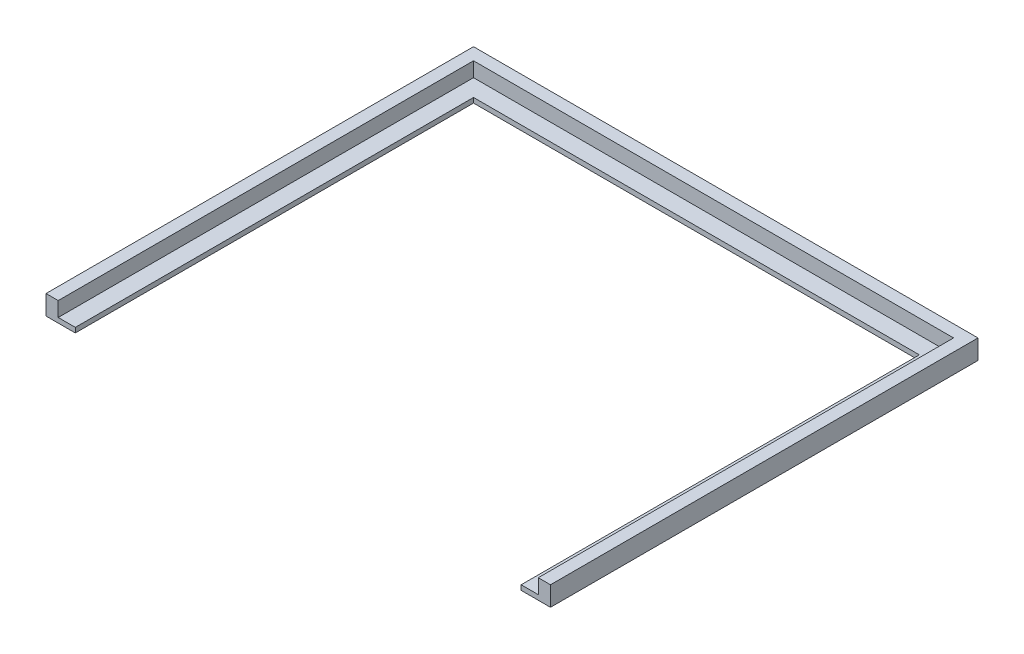
ISO-10303-21;
HEADER;
FILE_DESCRIPTION(('STEP AP214'),'2;1');
FILE_NAME('part.step','',(''),(''),'','','');
FILE_SCHEMA(('AUTOMOTIVE_DESIGN { 1 0 10303 214 1 1 1 1 }'));
ENDSEC;
DATA;
#1=APPLICATION_CONTEXT('core data for automotive mechanical design processes');
#2=APPLICATION_PROTOCOL_DEFINITION('international standard','automotive_design',2000,#1);
#3=PRODUCT_CONTEXT('',#1,'mechanical');
#4=PRODUCT('Part','Part','',(#3));
#5=PRODUCT_RELATED_PRODUCT_CATEGORY('part','',(#4));
#6=PRODUCT_DEFINITION_FORMATION('','',#4);
#7=PRODUCT_DEFINITION_CONTEXT('part definition',#1,'design');
#8=PRODUCT_DEFINITION('design','',#6,#7);
#9=PRODUCT_DEFINITION_SHAPE('','',#8);
#10=(LENGTH_UNIT() NAMED_UNIT(*) SI_UNIT(.MILLI.,.METRE.));
#11=(NAMED_UNIT(*) PLANE_ANGLE_UNIT() SI_UNIT($,.RADIAN.));
#12=(NAMED_UNIT(*) SI_UNIT($,.STERADIAN.) SOLID_ANGLE_UNIT());
#13=UNCERTAINTY_MEASURE_WITH_UNIT(LENGTH_MEASURE(1.E-05),#10,'distance_accuracy_value','');
#14=(GEOMETRIC_REPRESENTATION_CONTEXT(3) GLOBAL_UNCERTAINTY_ASSIGNED_CONTEXT((#13)) GLOBAL_UNIT_ASSIGNED_CONTEXT((#10,
#11,#12)) REPRESENTATION_CONTEXT('',''));
#15=CARTESIAN_POINT('',(0.,0.,0.));
#16=DIRECTION('',(0.,0.,1.));
#17=DIRECTION('',(1.,0.,0.));
#18=AXIS2_PLACEMENT_3D('',#15,#16,#17);
#19=CARTESIAN_POINT('',(0.,2.,0.));
#20=DIRECTION('',(0.,1.,0.));
#21=DIRECTION('',(0.,0.,1.));
#22=AXIS2_PLACEMENT_3D('',#19,#20,#21);
#23=PLANE('',#22);
#24=DIRECTION('',(-1.,0.,0.));
#25=VECTOR('',#24,1.);
#26=CARTESIAN_POINT('',(0.,2.,0.));
#27=LINE('',#26,#25);
#28=CARTESIAN_POINT('',(98.2499999999999,2.,0.));
#29=VERTEX_POINT('',#28);
#30=CARTESIAN_POINT('',(91.25,2.,0.));
#31=VERTEX_POINT('',#30);
#32=EDGE_CURVE('E142',#29,#31,#27,.T.);
#33=ORIENTED_EDGE('',*,*,#32,.F.);
#34=DIRECTION('',(0.,0.,-1.));
#35=VECTOR('',#34,1.);
#36=CARTESIAN_POINT('',(98.2499999999999,2.,170.));
#37=LINE('',#36,#35);
#38=CARTESIAN_POINT('',(98.2499999999999,2.,-170.));
#39=VERTEX_POINT('',#38);
#40=EDGE_CURVE('E205',#29,#39,#37,.T.);
#41=ORIENTED_EDGE('',*,*,#40,.T.);
#42=DIRECTION('',(-1.,0.,0.));
#43=VECTOR('',#42,1.);
#44=CARTESIAN_POINT('',(98.2499999999999,2.,-170.));
#45=LINE('',#44,#43);
#46=CARTESIAN_POINT('',(-98.25,2.,-170.));
#47=VERTEX_POINT('',#46);
#48=EDGE_CURVE('E211',#39,#47,#45,.T.);
#49=ORIENTED_EDGE('',*,*,#48,.T.);
#50=DIRECTION('',(0.,0.,1.));
#51=VECTOR('',#50,1.);
#52=CARTESIAN_POINT('',(-98.25,2.,-170.));
#53=LINE('',#52,#51);
#54=CARTESIAN_POINT('',(-98.25,2.,0.));
#55=VERTEX_POINT('',#54);
#56=EDGE_CURVE('E208',#47,#55,#53,.T.);
#57=ORIENTED_EDGE('',*,*,#56,.T.);
#58=CARTESIAN_POINT('',(-91.25,2.,0.));
#59=VERTEX_POINT('',#58);
#60=EDGE_CURVE('E54',#59,#55,#27,.T.);
#61=ORIENTED_EDGE('',*,*,#60,.F.);
#62=DIRECTION('',(0.,0.,1.));
#63=VECTOR('',#62,1.);
#64=CARTESIAN_POINT('',(-91.25,2.,163.));
#65=LINE('',#64,#63);
#66=CARTESIAN_POINT('',(-91.25,2.,-163.));
#67=VERTEX_POINT('',#66);
#68=EDGE_CURVE('E159',#67,#59,#65,.T.);
#69=ORIENTED_EDGE('',*,*,#68,.F.);
#70=DIRECTION('',(-1.,0.,0.));
#71=VECTOR('',#70,1.);
#72=CARTESIAN_POINT('',(91.25,2.,-163.));
#73=LINE('',#72,#71);
#74=CARTESIAN_POINT('',(91.25,2.,-163.));
#75=VERTEX_POINT('',#74);
#76=EDGE_CURVE('E165',#75,#67,#73,.T.);
#77=ORIENTED_EDGE('',*,*,#76,.F.);
#78=DIRECTION('',(0.,0.,-1.));
#79=VECTOR('',#78,1.);
#80=CARTESIAN_POINT('',(91.25,2.,163.));
#81=LINE('',#80,#79);
#82=EDGE_CURVE('E162',#31,#75,#81,.T.);
#83=ORIENTED_EDGE('',*,*,#82,.F.);
#84=EDGE_LOOP('',(#33,#41,#49,#57,#61,#69,#77,#83));
#85=FACE_BOUND('',#84,.T.);
#86=ADVANCED_FACE('F39',(#85),#23,.T.);
#87=CARTESIAN_POINT('',(0.,0.,0.));
#88=DIRECTION('',(0.,1.,0.));
#89=DIRECTION('',(0.,0.,1.));
#90=AXIS2_PLACEMENT_3D('',#87,#88,#89);
#91=PLANE('',#90);
#92=DIRECTION('',(0.,0.,-1.));
#93=VECTOR('',#92,1.);
#94=CARTESIAN_POINT('',(103.25,0.,175.));
#95=LINE('',#94,#93);
#96=CARTESIAN_POINT('',(103.25,0.,0.));
#97=VERTEX_POINT('',#96);
#98=CARTESIAN_POINT('',(103.25,0.,-175.));
#99=VERTEX_POINT('',#98);
#100=EDGE_CURVE('E179',#97,#99,#95,.T.);
#101=ORIENTED_EDGE('',*,*,#100,.F.);
#102=DIRECTION('',(-1.,0.,0.));
#103=VECTOR('',#102,1.);
#104=CARTESIAN_POINT('',(0.,0.,0.));
#105=LINE('',#104,#103);
#106=CARTESIAN_POINT('',(91.25,0.,0.));
#107=VERTEX_POINT('',#106);
#108=EDGE_CURVE('E128',#97,#107,#105,.T.);
#109=ORIENTED_EDGE('',*,*,#108,.T.);
#110=DIRECTION('',(0.,0.,-1.));
#111=VECTOR('',#110,1.);
#112=CARTESIAN_POINT('',(91.25,0.,163.));
#113=LINE('',#112,#111);
#114=CARTESIAN_POINT('',(91.25,0.,-163.));
#115=VERTEX_POINT('',#114);
#116=EDGE_CURVE('E152',#107,#115,#113,.T.);
#117=ORIENTED_EDGE('',*,*,#116,.T.);
#118=DIRECTION('',(-1.,0.,0.));
#119=VECTOR('',#118,1.);
#120=CARTESIAN_POINT('',(91.25,0.,-163.));
#121=LINE('',#120,#119);
#122=CARTESIAN_POINT('',(-91.25,0.,-163.));
#123=VERTEX_POINT('',#122);
#124=EDGE_CURVE('E163',#115,#123,#121,.T.);
#125=ORIENTED_EDGE('',*,*,#124,.T.);
#126=DIRECTION('',(0.,0.,1.));
#127=VECTOR('',#126,1.);
#128=CARTESIAN_POINT('',(-91.25,0.,163.));
#129=LINE('',#128,#127);
#130=CARTESIAN_POINT('',(-91.25,0.,0.));
#131=VERTEX_POINT('',#130);
#132=EDGE_CURVE('E148',#123,#131,#129,.T.);
#133=ORIENTED_EDGE('',*,*,#132,.T.);
#134=CARTESIAN_POINT('',(-103.25,0.,0.));
#135=VERTEX_POINT('',#134);
#136=EDGE_CURVE('E192',#131,#135,#105,.T.);
#137=ORIENTED_EDGE('',*,*,#136,.T.);
#138=DIRECTION('',(0.,0.,1.));
#139=VECTOR('',#138,1.);
#140=CARTESIAN_POINT('',(-103.25,0.,175.));
#141=LINE('',#140,#139);
#142=CARTESIAN_POINT('',(-103.25,0.,-175.));
#143=VERTEX_POINT('',#142);
#144=EDGE_CURVE('E176',#143,#135,#141,.T.);
#145=ORIENTED_EDGE('',*,*,#144,.F.);
#146=DIRECTION('',(-1.,0.,0.));
#147=VECTOR('',#146,1.);
#148=CARTESIAN_POINT('',(103.25,0.,-175.));
#149=LINE('',#148,#147);
#150=EDGE_CURVE('E181',#99,#143,#149,.T.);
#151=ORIENTED_EDGE('',*,*,#150,.F.);
#152=EDGE_LOOP('',(#101,#109,#117,#125,#133,#137,#145,#151));
#153=FACE_BOUND('',#152,.T.);
#154=ADVANCED_FACE('F190',(#153),#91,.F.);
#155=CARTESIAN_POINT('',(-103.25,2.,175.));
#156=DIRECTION('',(1.,0.,0.));
#157=DIRECTION('',(0.,0.,-1.));
#158=AXIS2_PLACEMENT_3D('',#155,#156,#157);
#159=PLANE('',#158);
#160=ORIENTED_EDGE('',*,*,#144,.T.);
#161=DIRECTION('',(0.,1.,0.));
#162=VECTOR('',#161,1.);
#163=CARTESIAN_POINT('',(-103.25,2.,0.));
#164=LINE('',#163,#162);
#165=CARTESIAN_POINT('',(-103.25,8.,0.));
#166=VERTEX_POINT('',#165);
#167=EDGE_CURVE('E196',#135,#166,#164,.T.);
#168=ORIENTED_EDGE('',*,*,#167,.T.);
#169=DIRECTION('',(0.,0.,1.));
#170=VECTOR('',#169,1.);
#171=CARTESIAN_POINT('',(-103.25,8.,-175.));
#172=LINE('',#171,#170);
#173=CARTESIAN_POINT('',(-103.25,8.,-175.));
#174=VERTEX_POINT('',#173);
#175=EDGE_CURVE('E149',#174,#166,#172,.T.);
#176=ORIENTED_EDGE('',*,*,#175,.F.);
#177=DIRECTION('',(0.,-1.,0.));
#178=VECTOR('',#177,1.);
#179=CARTESIAN_POINT('',(-103.25,2.,-175.));
#180=LINE('',#179,#178);
#181=EDGE_CURVE('E183',#174,#143,#180,.T.);
#182=ORIENTED_EDGE('',*,*,#181,.T.);
#183=EDGE_LOOP('',(#160,#168,#176,#182));
#184=FACE_BOUND('',#183,.T.);
#185=ADVANCED_FACE('F41',(#184),#159,.F.);
#186=CARTESIAN_POINT('',(103.25,2.,175.));
#187=DIRECTION('',(-1.,0.,0.));
#188=DIRECTION('',(0.,0.,1.));
#189=AXIS2_PLACEMENT_3D('',#186,#187,#188);
#190=PLANE('',#189);
#191=DIRECTION('',(0.,0.,-1.));
#192=VECTOR('',#191,1.);
#193=CARTESIAN_POINT('',(103.25,8.,175.));
#194=LINE('',#193,#192);
#195=CARTESIAN_POINT('',(103.25,8.,0.));
#196=VERTEX_POINT('',#195);
#197=CARTESIAN_POINT('',(103.25,8.,-175.));
#198=VERTEX_POINT('',#197);
#199=EDGE_CURVE('E138',#196,#198,#194,.T.);
#200=ORIENTED_EDGE('',*,*,#199,.F.);
#201=DIRECTION('',(0.,-1.,0.));
#202=VECTOR('',#201,1.);
#203=CARTESIAN_POINT('',(103.25,2.,0.));
#204=LINE('',#203,#202);
#205=EDGE_CURVE('E125',#196,#97,#204,.T.);
#206=ORIENTED_EDGE('',*,*,#205,.T.);
#207=ORIENTED_EDGE('',*,*,#100,.T.);
#208=DIRECTION('',(0.,-1.,0.));
#209=VECTOR('',#208,1.);
#210=CARTESIAN_POINT('',(103.25,2.,-175.));
#211=LINE('',#210,#209);
#212=EDGE_CURVE('E47',#198,#99,#211,.T.);
#213=ORIENTED_EDGE('',*,*,#212,.F.);
#214=EDGE_LOOP('',(#200,#206,#207,#213));
#215=FACE_BOUND('',#214,.T.);
#216=ADVANCED_FACE('F145',(#215),#190,.F.);
#217=CARTESIAN_POINT('',(103.25,2.,-175.));
#218=DIRECTION('',(0.,0.,1.));
#219=DIRECTION('',(1.,0.,0.));
#220=AXIS2_PLACEMENT_3D('',#217,#218,#219);
#221=PLANE('',#220);
#222=ORIENTED_EDGE('',*,*,#150,.T.);
#223=ORIENTED_EDGE('',*,*,#181,.F.);
#224=DIRECTION('',(-1.,0.,0.));
#225=VECTOR('',#224,1.);
#226=CARTESIAN_POINT('',(103.25,8.,-175.));
#227=LINE('',#226,#225);
#228=EDGE_CURVE('E155',#198,#174,#227,.T.);
#229=ORIENTED_EDGE('',*,*,#228,.F.);
#230=ORIENTED_EDGE('',*,*,#212,.T.);
#231=EDGE_LOOP('',(#222,#223,#229,#230));
#232=FACE_BOUND('',#231,.T.);
#233=ADVANCED_FACE('F187',(#232),#221,.F.);
#234=CARTESIAN_POINT('',(-91.25,2.,163.));
#235=DIRECTION('',(1.,0.,0.));
#236=DIRECTION('',(0.,0.,-1.));
#237=AXIS2_PLACEMENT_3D('',#234,#235,#236);
#238=PLANE('',#237);
#239=DIRECTION('',(0.,1.,0.));
#240=VECTOR('',#239,1.);
#241=CARTESIAN_POINT('',(-91.25,2.,0.));
#242=LINE('',#241,#240);
#243=EDGE_CURVE('E219',#131,#59,#242,.T.);
#244=ORIENTED_EDGE('',*,*,#243,.F.);
#245=ORIENTED_EDGE('',*,*,#132,.F.);
#246=DIRECTION('',(0.,-1.,0.));
#247=VECTOR('',#246,1.);
#248=CARTESIAN_POINT('',(-91.25,2.,-163.));
#249=LINE('',#248,#247);
#250=EDGE_CURVE('E166',#67,#123,#249,.T.);
#251=ORIENTED_EDGE('',*,*,#250,.F.);
#252=ORIENTED_EDGE('',*,*,#68,.T.);
#253=EDGE_LOOP('',(#244,#245,#251,#252));
#254=FACE_BOUND('',#253,.T.);
#255=ADVANCED_FACE('F254',(#254),#238,.T.);
#256=CARTESIAN_POINT('',(91.25,2.,163.));
#257=DIRECTION('',(-1.,0.,0.));
#258=DIRECTION('',(0.,0.,1.));
#259=AXIS2_PLACEMENT_3D('',#256,#257,#258);
#260=PLANE('',#259);
#261=DIRECTION('',(0.,-1.,0.));
#262=VECTOR('',#261,1.);
#263=CARTESIAN_POINT('',(91.25,2.,0.));
#264=LINE('',#263,#262);
#265=EDGE_CURVE('E223',#31,#107,#264,.T.);
#266=ORIENTED_EDGE('',*,*,#265,.F.);
#267=ORIENTED_EDGE('',*,*,#82,.T.);
#268=DIRECTION('',(0.,-1.,0.));
#269=VECTOR('',#268,1.);
#270=CARTESIAN_POINT('',(91.25,2.,-163.));
#271=LINE('',#270,#269);
#272=EDGE_CURVE('E173',#75,#115,#271,.T.);
#273=ORIENTED_EDGE('',*,*,#272,.T.);
#274=ORIENTED_EDGE('',*,*,#116,.F.);
#275=EDGE_LOOP('',(#266,#267,#273,#274));
#276=FACE_BOUND('',#275,.T.);
#277=ADVANCED_FACE('F246',(#276),#260,.T.);
#278=CARTESIAN_POINT('',(91.25,2.,-163.));
#279=DIRECTION('',(0.,0.,1.));
#280=DIRECTION('',(1.,0.,0.));
#281=AXIS2_PLACEMENT_3D('',#278,#279,#280);
#282=PLANE('',#281);
#283=ORIENTED_EDGE('',*,*,#124,.F.);
#284=ORIENTED_EDGE('',*,*,#272,.F.);
#285=ORIENTED_EDGE('',*,*,#76,.T.);
#286=ORIENTED_EDGE('',*,*,#250,.T.);
#287=EDGE_LOOP('',(#283,#284,#285,#286));
#288=FACE_BOUND('',#287,.T.);
#289=ADVANCED_FACE('F250',(#288),#282,.T.);
#290=CARTESIAN_POINT('',(0.,8.,0.));
#291=DIRECTION('',(0.,1.,0.));
#292=DIRECTION('',(0.,0.,1.));
#293=AXIS2_PLACEMENT_3D('',#290,#291,#292);
#294=PLANE('',#293);
#295=DIRECTION('',(-1.,0.,0.));
#296=VECTOR('',#295,1.);
#297=CARTESIAN_POINT('',(-200.,8.,0.));
#298=LINE('',#297,#296);
#299=CARTESIAN_POINT('',(98.2499999999999,8.,0.));
#300=VERTEX_POINT('',#299);
#301=EDGE_CURVE('E61',#196,#300,#298,.T.);
#302=ORIENTED_EDGE('',*,*,#301,.F.);
#303=ORIENTED_EDGE('',*,*,#199,.T.);
#304=ORIENTED_EDGE('',*,*,#228,.T.);
#305=ORIENTED_EDGE('',*,*,#175,.T.);
#306=CARTESIAN_POINT('',(-98.25,8.,0.));
#307=VERTEX_POINT('',#306);
#308=EDGE_CURVE('E143',#307,#166,#298,.T.);
#309=ORIENTED_EDGE('',*,*,#308,.F.);
#310=DIRECTION('',(0.,0.,1.));
#311=VECTOR('',#310,1.);
#312=CARTESIAN_POINT('',(-98.25,8.,-170.));
#313=LINE('',#312,#311);
#314=CARTESIAN_POINT('',(-98.25,8.,-170.));
#315=VERTEX_POINT('',#314);
#316=EDGE_CURVE('E214',#315,#307,#313,.T.);
#317=ORIENTED_EDGE('',*,*,#316,.F.);
#318=DIRECTION('',(-1.,0.,0.));
#319=VECTOR('',#318,1.);
#320=CARTESIAN_POINT('',(98.2499999999999,8.,-170.));
#321=LINE('',#320,#319);
#322=CARTESIAN_POINT('',(98.2499999999999,8.,-170.));
#323=VERTEX_POINT('',#322);
#324=EDGE_CURVE('E207',#323,#315,#321,.T.);
#325=ORIENTED_EDGE('',*,*,#324,.F.);
#326=DIRECTION('',(0.,0.,-1.));
#327=VECTOR('',#326,1.);
#328=CARTESIAN_POINT('',(98.2499999999999,8.,170.));
#329=LINE('',#328,#327);
#330=EDGE_CURVE('E141',#300,#323,#329,.T.);
#331=ORIENTED_EDGE('',*,*,#330,.F.);
#332=EDGE_LOOP('',(#302,#303,#304,#305,#309,#317,#325,#331));
#333=FACE_BOUND('',#332,.T.);
#334=ADVANCED_FACE('F136',(#333),#294,.T.);
#335=CARTESIAN_POINT('',(98.2499999999999,8.,-170.));
#336=DIRECTION('',(0.,0.,1.));
#337=DIRECTION('',(1.,0.,0.));
#338=AXIS2_PLACEMENT_3D('',#335,#336,#337);
#339=PLANE('',#338);
#340=ORIENTED_EDGE('',*,*,#48,.F.);
#341=DIRECTION('',(0.,-1.,0.));
#342=VECTOR('',#341,1.);
#343=CARTESIAN_POINT('',(98.2499999999999,8.,-170.));
#344=LINE('',#343,#342);
#345=EDGE_CURVE('E200',#323,#39,#344,.T.);
#346=ORIENTED_EDGE('',*,*,#345,.F.);
#347=ORIENTED_EDGE('',*,*,#324,.T.);
#348=DIRECTION('',(0.,-1.,0.));
#349=VECTOR('',#348,1.);
#350=CARTESIAN_POINT('',(-98.25,8.,-170.));
#351=LINE('',#350,#349);
#352=EDGE_CURVE('E198',#315,#47,#351,.T.);
#353=ORIENTED_EDGE('',*,*,#352,.T.);
#354=EDGE_LOOP('',(#340,#346,#347,#353));
#355=FACE_BOUND('',#354,.T.);
#356=ADVANCED_FACE('F233',(#355),#339,.T.);
#357=CARTESIAN_POINT('',(-98.25,8.,-170.));
#358=DIRECTION('',(1.,0.,0.));
#359=DIRECTION('',(0.,0.,-1.));
#360=AXIS2_PLACEMENT_3D('',#357,#358,#359);
#361=PLANE('',#360);
#362=DIRECTION('',(0.,1.,0.));
#363=VECTOR('',#362,1.);
#364=CARTESIAN_POINT('',(-98.25,8.,0.));
#365=LINE('',#364,#363);
#366=EDGE_CURVE('E132',#55,#307,#365,.T.);
#367=ORIENTED_EDGE('',*,*,#366,.F.);
#368=ORIENTED_EDGE('',*,*,#56,.F.);
#369=ORIENTED_EDGE('',*,*,#352,.F.);
#370=ORIENTED_EDGE('',*,*,#316,.T.);
#371=EDGE_LOOP('',(#367,#368,#369,#370));
#372=FACE_BOUND('',#371,.T.);
#373=ADVANCED_FACE('F229',(#372),#361,.T.);
#374=CARTESIAN_POINT('',(98.2499999999999,8.,170.));
#375=DIRECTION('',(-1.,0.,0.));
#376=DIRECTION('',(0.,0.,1.));
#377=AXIS2_PLACEMENT_3D('',#374,#375,#376);
#378=PLANE('',#377);
#379=DIRECTION('',(0.,-1.,0.));
#380=VECTOR('',#379,1.);
#381=CARTESIAN_POINT('',(98.2499999999999,8.,0.));
#382=LINE('',#381,#380);
#383=EDGE_CURVE('E11',#300,#29,#382,.T.);
#384=ORIENTED_EDGE('',*,*,#383,.F.);
#385=ORIENTED_EDGE('',*,*,#330,.T.);
#386=ORIENTED_EDGE('',*,*,#345,.T.);
#387=ORIENTED_EDGE('',*,*,#40,.F.);
#388=EDGE_LOOP('',(#384,#385,#386,#387));
#389=FACE_BOUND('',#388,.T.);
#390=ADVANCED_FACE('F237',(#389),#378,.T.);
#391=CARTESIAN_POINT('',(-200.,-1.2E-05,0.));
#392=DIRECTION('',(0.,0.,-1.));
#393=DIRECTION('',(-1.,0.,0.));
#394=AXIS2_PLACEMENT_3D('',#391,#392,#393);
#395=PLANE('',#394);
#396=ORIENTED_EDGE('',*,*,#301,.T.);
#397=ORIENTED_EDGE('',*,*,#383,.T.);
#398=ORIENTED_EDGE('',*,*,#32,.T.);
#399=ORIENTED_EDGE('',*,*,#265,.T.);
#400=ORIENTED_EDGE('',*,*,#108,.F.);
#401=ORIENTED_EDGE('',*,*,#205,.F.);
#402=EDGE_LOOP('',(#396,#397,#398,#399,#400,#401));
#403=FACE_BOUND('',#402,.T.);
#404=ADVANCED_FACE('F126',(#403),#395,.F.);
#405=ORIENTED_EDGE('',*,*,#136,.F.);
#406=ORIENTED_EDGE('',*,*,#243,.T.);
#407=ORIENTED_EDGE('',*,*,#60,.T.);
#408=ORIENTED_EDGE('',*,*,#366,.T.);
#409=ORIENTED_EDGE('',*,*,#308,.T.);
#410=ORIENTED_EDGE('',*,*,#167,.F.);
#411=EDGE_LOOP('',(#405,#406,#407,#408,#409,#410));
#412=FACE_BOUND('',#411,.T.);
#413=ADVANCED_FACE('F225',(#412),#395,.F.);
#414=CLOSED_SHELL('',(#86,#154,#185,#216,#233,#255,#277,#289,#334,#356,#373,#390,#404,#413));
#415=MANIFOLD_SOLID_BREP('B2',#414);
#416=ADVANCED_BREP_SHAPE_REPRESENTATION('',(#18,#415),#14);
#417=SHAPE_DEFINITION_REPRESENTATION(#9,#416);
ENDSEC;
END-ISO-10303-21;
